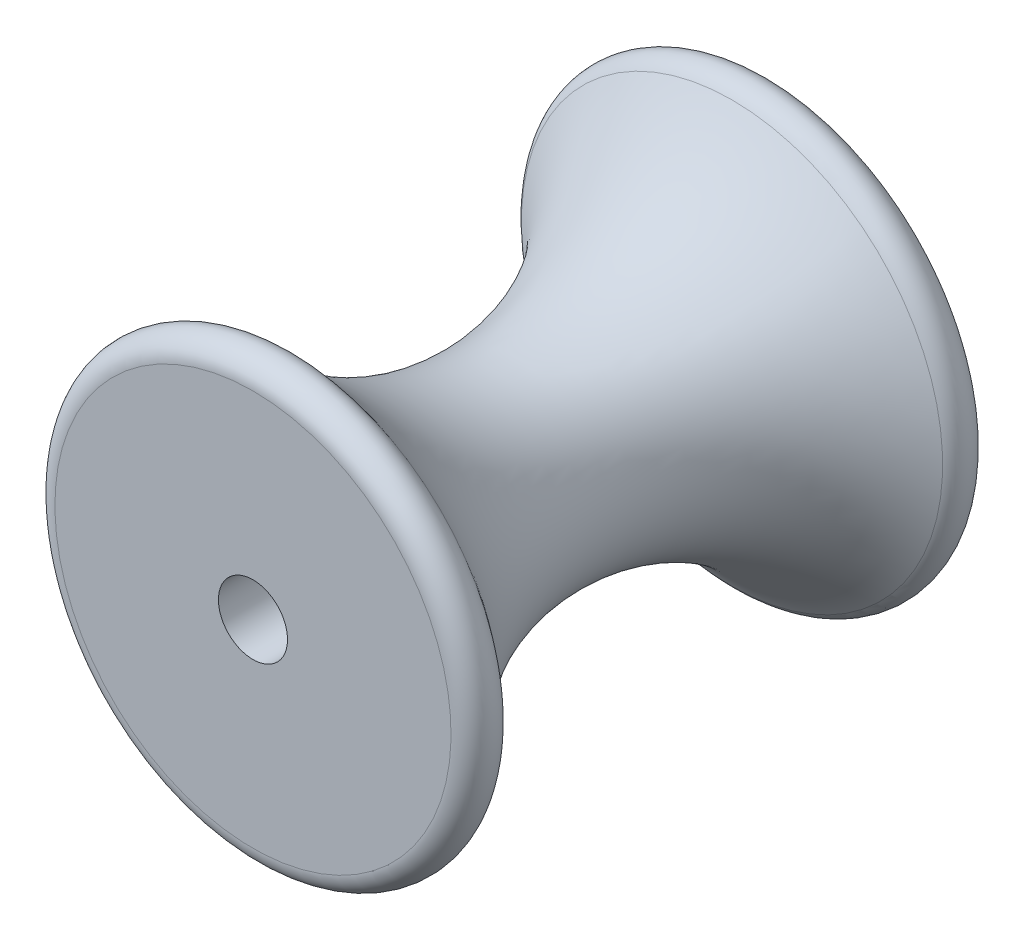
ISO-10303-21;
HEADER;
FILE_DESCRIPTION(('STEP AP214'),'2;1');
FILE_NAME('part.step','',(''),(''),'','','');
FILE_SCHEMA(('AUTOMOTIVE_DESIGN { 1 0 10303 214 1 1 1 1 }'));
ENDSEC;
DATA;
#1=APPLICATION_CONTEXT('core data for automotive mechanical design processes');
#2=APPLICATION_PROTOCOL_DEFINITION('international standard','automotive_design',2000,#1);
#3=PRODUCT_CONTEXT('',#1,'mechanical');
#4=PRODUCT('Part','Part','',(#3));
#5=PRODUCT_RELATED_PRODUCT_CATEGORY('part','',(#4));
#6=PRODUCT_DEFINITION_FORMATION('','',#4);
#7=PRODUCT_DEFINITION_CONTEXT('part definition',#1,'design');
#8=PRODUCT_DEFINITION('design','',#6,#7);
#9=PRODUCT_DEFINITION_SHAPE('','',#8);
#10=(LENGTH_UNIT() NAMED_UNIT(*) SI_UNIT(.MILLI.,.METRE.));
#11=(NAMED_UNIT(*) PLANE_ANGLE_UNIT() SI_UNIT($,.RADIAN.));
#12=(NAMED_UNIT(*) SI_UNIT($,.STERADIAN.) SOLID_ANGLE_UNIT());
#13=UNCERTAINTY_MEASURE_WITH_UNIT(LENGTH_MEASURE(1.E-05),#10,'distance_accuracy_value','');
#14=(GEOMETRIC_REPRESENTATION_CONTEXT(3) GLOBAL_UNCERTAINTY_ASSIGNED_CONTEXT((#13)) GLOBAL_UNIT_ASSIGNED_CONTEXT((#10,
#11,#12)) REPRESENTATION_CONTEXT('',''));
#15=CARTESIAN_POINT('',(0.,0.,0.));
#16=DIRECTION('',(0.,0.,1.));
#17=DIRECTION('',(1.,0.,0.));
#18=AXIS2_PLACEMENT_3D('',#15,#16,#17);
#19=CARTESIAN_POINT('',(0.,0.,-12.));
#20=DIRECTION('',(0.,0.,-1.));
#21=DIRECTION('',(0.,1.,0.));
#22=AXIS2_PLACEMENT_3D('',#19,#20,#21);
#23=PLANE('',#22);
#24=CARTESIAN_POINT('',(0.,0.,-12.));
#25=DIRECTION('',(0.,0.,-1.));
#26=DIRECTION('',(0.,1.,0.));
#27=AXIS2_PLACEMENT_3D('',#24,#25,#26);
#28=CIRCLE('',#27,9.17376207875074);
#29=CARTESIAN_POINT('',(0.,9.17376207875074,-12.));
#30=VERTEX_POINT('',#29);
#31=EDGE_CURVE('E10',#30,#30,#28,.T.);
#32=ORIENTED_EDGE('',*,*,#31,.T.);
#33=EDGE_LOOP('',(#32));
#34=FACE_BOUND('',#33,.T.);
#35=CARTESIAN_POINT('',(0.,0.,-12.));
#36=DIRECTION('',(0.,0.,-1.));
#37=DIRECTION('',(0.,1.,0.));
#38=AXIS2_PLACEMENT_3D('',#35,#36,#37);
#39=CIRCLE('',#38,1.60000000000001);
#40=CARTESIAN_POINT('',(0.,1.60000000000001,-12.));
#41=VERTEX_POINT('',#40);
#42=EDGE_CURVE('E62',#41,#41,#39,.T.);
#43=ORIENTED_EDGE('',*,*,#42,.F.);
#44=EDGE_LOOP('',(#43));
#45=FACE_BOUND('',#44,.T.);
#46=ADVANCED_FACE('F39',(#34,#45),#23,.T.);
#47=CARTESIAN_POINT('',(0.,0.,0.));
#48=DIRECTION('',(0.,0.,-1.));
#49=DIRECTION('',(0.,1.,0.));
#50=AXIS2_PLACEMENT_3D('',#47,#48,#49);
#51=TOROIDAL_SURFACE('',#50,17.,12.5);
#52=CARTESIAN_POINT('',(0.,0.,10.1851851851852));
#53=DIRECTION('',(0.,0.,-1.));
#54=DIRECTION('',(0.,1.,0.));
#55=AXIS2_PLACEMENT_3D('',#52,#53,#54);
#56=CIRCLE('',#55,9.75348340625069);
#57=CARTESIAN_POINT('',(0.,9.75348340625068,10.1851851851852));
#58=VERTEX_POINT('',#57);
#59=EDGE_CURVE('E50',#58,#58,#56,.T.);
#60=ORIENTED_EDGE('',*,*,#59,.T.);
#61=EDGE_LOOP('',(#60));
#62=FACE_BOUND('',#61,.T.);
#63=CARTESIAN_POINT('',(0.,0.,-10.1851851851852));
#64=DIRECTION('',(0.,0.,1.));
#65=DIRECTION('',(0.,-1.,0.));
#66=AXIS2_PLACEMENT_3D('',#63,#64,#65);
#67=CIRCLE('',#66,9.75348340625068);
#68=CARTESIAN_POINT('',(0.,-9.75348340625068,-10.1851851851852));
#69=VERTEX_POINT('',#68);
#70=EDGE_CURVE('E54',#69,#69,#67,.T.);
#71=ORIENTED_EDGE('',*,*,#70,.T.);
#72=EDGE_LOOP('',(#71));
#73=FACE_BOUND('',#72,.T.);
#74=ADVANCED_FACE('F69',(#62,#73),#51,.F.);
#75=CARTESIAN_POINT('',(0.,0.,12.));
#76=DIRECTION('',(0.,0.,-1.));
#77=DIRECTION('',(0.,1.,0.));
#78=AXIS2_PLACEMENT_3D('',#75,#76,#77);
#79=PLANE('',#78);
#80=CARTESIAN_POINT('',(0.,0.,12.));
#81=DIRECTION('',(0.,0.,-1.));
#82=DIRECTION('',(0.,1.,0.));
#83=AXIS2_PLACEMENT_3D('',#80,#81,#82);
#84=CIRCLE('',#83,9.17376207875075);
#85=CARTESIAN_POINT('',(0.,9.17376207875074,12.));
#86=VERTEX_POINT('',#85);
#87=EDGE_CURVE('E46',#86,#86,#84,.F.);
#88=ORIENTED_EDGE('',*,*,#87,.T.);
#89=EDGE_LOOP('',(#88));
#90=FACE_BOUND('',#89,.T.);
#91=CARTESIAN_POINT('',(0.,0.,12.));
#92=DIRECTION('',(0.,0.,-1.));
#93=DIRECTION('',(0.,1.,0.));
#94=AXIS2_PLACEMENT_3D('',#91,#92,#93);
#95=CIRCLE('',#94,1.60000000000001);
#96=CARTESIAN_POINT('',(0.,1.6,12.));
#97=VERTEX_POINT('',#96);
#98=EDGE_CURVE('E59',#97,#97,#95,.T.);
#99=ORIENTED_EDGE('',*,*,#98,.T.);
#100=EDGE_LOOP('',(#99));
#101=FACE_BOUND('',#100,.T.);
#102=ADVANCED_FACE('F75',(#90,#101),#79,.F.);
#103=CARTESIAN_POINT('',(0.,0.,-12.5));
#104=DIRECTION('',(0.,0.,-1.));
#105=DIRECTION('',(0.,1.,0.));
#106=AXIS2_PLACEMENT_3D('',#103,#104,#105);
#107=CYLINDRICAL_SURFACE('',#106,1.60000000000001);
#108=ORIENTED_EDGE('',*,*,#98,.F.);
#109=EDGE_LOOP('',(#108));
#110=FACE_BOUND('',#109,.T.);
#111=ORIENTED_EDGE('',*,*,#42,.T.);
#112=EDGE_LOOP('',(#111));
#113=FACE_BOUND('',#112,.T.);
#114=ADVANCED_FACE('F66',(#110,#113),#107,.F.);
#115=CARTESIAN_POINT('',(0.,0.,11.));
#116=DIRECTION('',(0.,0.,1.));
#117=DIRECTION('',(0.,-1.,0.));
#118=AXIS2_PLACEMENT_3D('',#115,#116,#117);
#119=TOROIDAL_SURFACE('',#118,9.17376207875075,1.);
#120=ORIENTED_EDGE('',*,*,#87,.F.);
#121=EDGE_LOOP('',(#120));
#122=FACE_BOUND('',#121,.T.);
#123=ORIENTED_EDGE('',*,*,#59,.F.);
#124=EDGE_LOOP('',(#123));
#125=FACE_BOUND('',#124,.T.);
#126=ADVANCED_FACE('F79',(#122,#125),#119,.T.);
#127=CARTESIAN_POINT('',(0.,0.,-11.));
#128=DIRECTION('',(0.,0.,1.));
#129=DIRECTION('',(0.,-1.,0.));
#130=AXIS2_PLACEMENT_3D('',#127,#128,#129);
#131=TOROIDAL_SURFACE('',#130,9.17376207875074,1.);
#132=ORIENTED_EDGE('',*,*,#70,.F.);
#133=EDGE_LOOP('',(#132));
#134=FACE_BOUND('',#133,.T.);
#135=ORIENTED_EDGE('',*,*,#31,.F.);
#136=EDGE_LOOP('',(#135));
#137=FACE_BOUND('',#136,.T.);
#138=ADVANCED_FACE('F41',(#134,#137),#131,.T.);
#139=CLOSED_SHELL('',(#46,#74,#102,#114,#126,#138));
#140=MANIFOLD_SOLID_BREP('B2',#139);
#141=ADVANCED_BREP_SHAPE_REPRESENTATION('',(#18,#140),#14);
#142=SHAPE_DEFINITION_REPRESENTATION(#9,#141);
ENDSEC;
END-ISO-10303-21;
